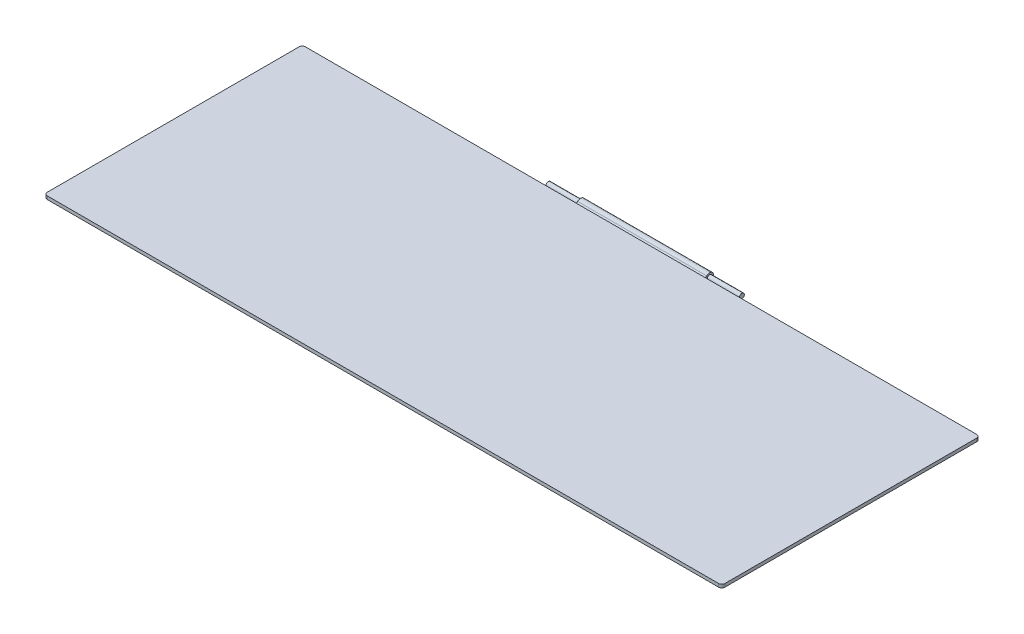
ISO-10303-21;
HEADER;
FILE_DESCRIPTION(('STEP AP214'),'2;1');
FILE_NAME('part.step','',(''),(''),'','','');
FILE_SCHEMA(('AUTOMOTIVE_DESIGN { 1 0 10303 214 1 1 1 1 }'));
ENDSEC;
DATA;
#1=APPLICATION_CONTEXT('core data for automotive mechanical design processes');
#2=APPLICATION_PROTOCOL_DEFINITION('international standard','automotive_design',2000,#1);
#3=PRODUCT_CONTEXT('',#1,'mechanical');
#4=PRODUCT('Part','Part','',(#3));
#5=PRODUCT_RELATED_PRODUCT_CATEGORY('part','',(#4));
#6=PRODUCT_DEFINITION_FORMATION('','',#4);
#7=PRODUCT_DEFINITION_CONTEXT('part definition',#1,'design');
#8=PRODUCT_DEFINITION('design','',#6,#7);
#9=PRODUCT_DEFINITION_SHAPE('','',#8);
#10=(LENGTH_UNIT() NAMED_UNIT(*) SI_UNIT(.MILLI.,.METRE.));
#11=(NAMED_UNIT(*) PLANE_ANGLE_UNIT() SI_UNIT($,.RADIAN.));
#12=(NAMED_UNIT(*) SI_UNIT($,.STERADIAN.) SOLID_ANGLE_UNIT());
#13=UNCERTAINTY_MEASURE_WITH_UNIT(LENGTH_MEASURE(1.E-05),#10,'distance_accuracy_value','');
#14=(GEOMETRIC_REPRESENTATION_CONTEXT(3) GLOBAL_UNCERTAINTY_ASSIGNED_CONTEXT((#13)) GLOBAL_UNIT_ASSIGNED_CONTEXT((#10,
#11,#12)) REPRESENTATION_CONTEXT('',''));
#15=CARTESIAN_POINT('',(0.,0.,0.));
#16=DIRECTION('',(0.,0.,1.));
#17=DIRECTION('',(1.,0.,0.));
#18=AXIS2_PLACEMENT_3D('',#15,#16,#17);
#19=CARTESIAN_POINT('',(0.,0.,0.));
#20=DIRECTION('',(0.,0.,-1.));
#21=DIRECTION('',(-1.,0.,0.));
#22=AXIS2_PLACEMENT_3D('',#19,#20,#21);
#23=PLANE('',#22);
#24=DIRECTION('',(-1.,0.,0.));
#25=VECTOR('',#24,1.);
#26=CARTESIAN_POINT('',(266.7,-1.26999999999997,0.));
#27=LINE('',#26,#25);
#28=CARTESIAN_POINT('',(264.16,-1.26999999999997,0.));
#29=VERTEX_POINT('',#28);
#30=CARTESIAN_POINT('',(50.8,-1.26999999999999,0.));
#31=VERTEX_POINT('',#30);
#32=EDGE_CURVE('E179',#29,#31,#27,.T.);
#33=ORIENTED_EDGE('',*,*,#32,.T.);
#34=DIRECTION('',(0.,1.,0.));
#35=VECTOR('',#34,1.);
#36=CARTESIAN_POINT('',(50.8,0.,0.));
#37=LINE('',#36,#35);
#38=CARTESIAN_POINT('',(50.8,1.27000000000001,0.));
#39=VERTEX_POINT('',#38);
#40=EDGE_CURVE('E50',#31,#39,#37,.T.);
#41=ORIENTED_EDGE('',*,*,#40,.T.);
#42=DIRECTION('',(-1.,0.,0.));
#43=VECTOR('',#42,1.);
#44=CARTESIAN_POINT('',(266.7,1.27000000000003,0.));
#45=LINE('',#44,#43);
#46=CARTESIAN_POINT('',(264.16,1.27000000000003,0.));
#47=VERTEX_POINT('',#46);
#48=EDGE_CURVE('E175',#47,#39,#45,.T.);
#49=ORIENTED_EDGE('',*,*,#48,.F.);
#50=DIRECTION('',(0.,-1.,0.));
#51=VECTOR('',#50,1.);
#52=CARTESIAN_POINT('',(264.16,0.,0.));
#53=LINE('',#52,#51);
#54=EDGE_CURVE('E208',#47,#29,#53,.T.);
#55=ORIENTED_EDGE('',*,*,#54,.T.);
#56=EDGE_LOOP('',(#33,#41,#49,#55));
#57=FACE_BOUND('',#56,.T.);
#58=ADVANCED_FACE('F35',(#57),#23,.T.);
#59=CARTESIAN_POINT('',(266.7,1.27000000000003,203.2));
#60=DIRECTION('',(1.,0.,0.));
#61=DIRECTION('',(0.,0.,-1.));
#62=AXIS2_PLACEMENT_3D('',#59,#60,#61);
#63=PLANE('',#62);
#64=DIRECTION('',(0.,0.,-1.));
#65=VECTOR('',#64,1.);
#66=CARTESIAN_POINT('',(266.7,-1.26999999999997,203.2));
#67=LINE('',#66,#65);
#68=CARTESIAN_POINT('',(266.7,-1.26999999999997,200.66));
#69=VERTEX_POINT('',#68);
#70=CARTESIAN_POINT('',(266.7,-1.26999999999997,2.53999999999999));
#71=VERTEX_POINT('',#70);
#72=EDGE_CURVE('E178',#69,#71,#67,.T.);
#73=ORIENTED_EDGE('',*,*,#72,.T.);
#74=DIRECTION('',(0.,-1.,0.));
#75=VECTOR('',#74,1.);
#76=CARTESIAN_POINT('',(266.7,1.27000000000003,2.53999999999999));
#77=LINE('',#76,#75);
#78=CARTESIAN_POINT('',(266.7,1.27000000000003,2.53999999999999));
#79=VERTEX_POINT('',#78);
#80=EDGE_CURVE('E225',#71,#79,#77,.F.);
#81=ORIENTED_EDGE('',*,*,#80,.T.);
#82=DIRECTION('',(0.,0.,-1.));
#83=VECTOR('',#82,1.);
#84=CARTESIAN_POINT('',(266.7,1.27000000000003,203.2));
#85=LINE('',#84,#83);
#86=CARTESIAN_POINT('',(266.7,1.27000000000003,200.66));
#87=VERTEX_POINT('',#86);
#88=EDGE_CURVE('E183',#87,#79,#85,.T.);
#89=ORIENTED_EDGE('',*,*,#88,.F.);
#90=DIRECTION('',(0.,-1.,0.));
#91=VECTOR('',#90,1.);
#92=CARTESIAN_POINT('',(266.7,-1.26999999999997,200.66));
#93=LINE('',#92,#91);
#94=EDGE_CURVE('E222',#87,#69,#93,.T.);
#95=ORIENTED_EDGE('',*,*,#94,.T.);
#96=EDGE_LOOP('',(#73,#81,#89,#95));
#97=FACE_BOUND('',#96,.T.);
#98=ADVANCED_FACE('F246',(#97),#63,.T.);
#99=CARTESIAN_POINT('',(266.7,1.27000000000003,203.2));
#100=DIRECTION('',(0.,-1.,0.));
#101=DIRECTION('',(1.,0.,0.));
#102=AXIS2_PLACEMENT_3D('',#99,#100,#101);
#103=PLANE('',#102);
#104=ORIENTED_EDGE('',*,*,#48,.T.);
#105=DIRECTION('',(-1.,0.,0.));
#106=VECTOR('',#105,1.);
#107=CARTESIAN_POINT('',(50.8,1.26999999999997,0.));
#108=LINE('',#107,#106);
#109=CARTESIAN_POINT('',(-50.8,1.26999999999997,0.));
#110=VERTEX_POINT('',#109);
#111=EDGE_CURVE('E149',#39,#110,#108,.T.);
#112=ORIENTED_EDGE('',*,*,#111,.T.);
#113=CARTESIAN_POINT('',(-264.16,1.26999999999997,0.));
#114=VERTEX_POINT('',#113);
#115=EDGE_CURVE('E181',#110,#114,#45,.T.);
#116=ORIENTED_EDGE('',*,*,#115,.T.);
#117=CARTESIAN_POINT('',(-264.16,1.26999999999997,2.53999999999999));
#118=DIRECTION('',(0.,-1.,0.));
#119=DIRECTION('',(1.,0.,0.));
#120=AXIS2_PLACEMENT_3D('',#117,#118,#119);
#121=CIRCLE('',#120,2.54);
#122=CARTESIAN_POINT('',(-266.7,1.26999999999997,2.53999999999999));
#123=VERTEX_POINT('',#122);
#124=EDGE_CURVE('E220',#114,#123,#121,.F.);
#125=ORIENTED_EDGE('',*,*,#124,.T.);
#126=DIRECTION('',(0.,0.,-1.));
#127=VECTOR('',#126,1.);
#128=CARTESIAN_POINT('',(-266.7,1.26999999999997,203.2));
#129=LINE('',#128,#127);
#130=CARTESIAN_POINT('',(-266.7,1.26999999999997,200.66));
#131=VERTEX_POINT('',#130);
#132=EDGE_CURVE('E187',#131,#123,#129,.T.);
#133=ORIENTED_EDGE('',*,*,#132,.F.);
#134=CARTESIAN_POINT('',(-264.16,1.26999999999997,200.66));
#135=DIRECTION('',(0.,-1.,0.));
#136=DIRECTION('',(1.,0.,0.));
#137=AXIS2_PLACEMENT_3D('',#134,#135,#136);
#138=CIRCLE('',#137,2.54);
#139=CARTESIAN_POINT('',(-264.16,1.26999999999997,203.2));
#140=VERTEX_POINT('',#139);
#141=EDGE_CURVE('E214',#131,#140,#138,.F.);
#142=ORIENTED_EDGE('',*,*,#141,.T.);
#143=DIRECTION('',(-1.,0.,0.));
#144=VECTOR('',#143,1.);
#145=CARTESIAN_POINT('',(266.7,1.27000000000003,203.2));
#146=LINE('',#145,#144);
#147=CARTESIAN_POINT('',(264.16,1.27000000000003,203.2));
#148=VERTEX_POINT('',#147);
#149=EDGE_CURVE('E174',#148,#140,#146,.T.);
#150=ORIENTED_EDGE('',*,*,#149,.F.);
#151=CARTESIAN_POINT('',(264.16,1.27000000000003,200.66));
#152=DIRECTION('',(0.,-1.,0.));
#153=DIRECTION('',(1.,0.,0.));
#154=AXIS2_PLACEMENT_3D('',#151,#152,#153);
#155=CIRCLE('',#154,2.54);
#156=EDGE_CURVE('E216',#148,#87,#155,.F.);
#157=ORIENTED_EDGE('',*,*,#156,.T.);
#158=ORIENTED_EDGE('',*,*,#88,.T.);
#159=CARTESIAN_POINT('',(264.16,1.27000000000003,2.54));
#160=DIRECTION('',(0.,-1.,0.));
#161=DIRECTION('',(1.,0.,0.));
#162=AXIS2_PLACEMENT_3D('',#159,#160,#161);
#163=CIRCLE('',#162,2.54);
#164=EDGE_CURVE('E218',#79,#47,#163,.F.);
#165=ORIENTED_EDGE('',*,*,#164,.T.);
#166=EDGE_LOOP('',(#104,#112,#116,#125,#133,#142,#150,#157,#158,#165));
#167=FACE_BOUND('',#166,.T.);
#168=ADVANCED_FACE('F238',(#167),#103,.F.);
#169=CARTESIAN_POINT('',(-266.7,1.26999999999997,203.2));
#170=DIRECTION('',(1.,0.,0.));
#171=DIRECTION('',(0.,0.,-1.));
#172=AXIS2_PLACEMENT_3D('',#169,#170,#171);
#173=PLANE('',#172);
#174=ORIENTED_EDGE('',*,*,#132,.T.);
#175=DIRECTION('',(0.,-1.,0.));
#176=VECTOR('',#175,1.);
#177=CARTESIAN_POINT('',(-266.7,-1.27000000000003,2.53999999999999));
#178=LINE('',#177,#176);
#179=CARTESIAN_POINT('',(-266.7,-1.27000000000003,2.53999999999999));
#180=VERTEX_POINT('',#179);
#181=EDGE_CURVE('E196',#123,#180,#178,.T.);
#182=ORIENTED_EDGE('',*,*,#181,.T.);
#183=DIRECTION('',(0.,0.,-1.));
#184=VECTOR('',#183,1.);
#185=CARTESIAN_POINT('',(-266.7,-1.27000000000003,203.2));
#186=LINE('',#185,#184);
#187=CARTESIAN_POINT('',(-266.7,-1.27000000000003,200.66));
#188=VERTEX_POINT('',#187);
#189=EDGE_CURVE('E190',#188,#180,#186,.T.);
#190=ORIENTED_EDGE('',*,*,#189,.F.);
#191=DIRECTION('',(0.,-1.,0.));
#192=VECTOR('',#191,1.);
#193=CARTESIAN_POINT('',(-266.7,1.26999999999997,200.66));
#194=LINE('',#193,#192);
#195=EDGE_CURVE('E186',#188,#131,#194,.F.);
#196=ORIENTED_EDGE('',*,*,#195,.T.);
#197=EDGE_LOOP('',(#174,#182,#190,#196));
#198=FACE_BOUND('',#197,.T.);
#199=ADVANCED_FACE('F268',(#198),#173,.F.);
#200=CARTESIAN_POINT('',(266.7,-1.26999999999997,203.2));
#201=DIRECTION('',(0.,-1.,0.));
#202=DIRECTION('',(1.,0.,0.));
#203=AXIS2_PLACEMENT_3D('',#200,#201,#202);
#204=PLANE('',#203);
#205=ORIENTED_EDGE('',*,*,#189,.T.);
#206=CARTESIAN_POINT('',(-264.16,-1.27000000000003,2.53999999999999));
#207=DIRECTION('',(0.,-1.,0.));
#208=DIRECTION('',(1.,0.,0.));
#209=AXIS2_PLACEMENT_3D('',#206,#207,#208);
#210=CIRCLE('',#209,2.54);
#211=CARTESIAN_POINT('',(-264.16,-1.27000000000003,0.));
#212=VERTEX_POINT('',#211);
#213=EDGE_CURVE('E205',#180,#212,#210,.T.);
#214=ORIENTED_EDGE('',*,*,#213,.T.);
#215=CARTESIAN_POINT('',(-50.8,-1.27000000000001,0.));
#216=VERTEX_POINT('',#215);
#217=EDGE_CURVE('E166',#216,#212,#27,.T.);
#218=ORIENTED_EDGE('',*,*,#217,.F.);
#219=DIRECTION('',(-1.,0.,0.));
#220=VECTOR('',#219,1.);
#221=CARTESIAN_POINT('',(50.8,-1.27000000000003,0.));
#222=LINE('',#221,#220);
#223=EDGE_CURVE('E167',#31,#216,#222,.T.);
#224=ORIENTED_EDGE('',*,*,#223,.F.);
#225=ORIENTED_EDGE('',*,*,#32,.F.);
#226=CARTESIAN_POINT('',(264.16,-1.26999999999997,2.54));
#227=DIRECTION('',(0.,-1.,0.));
#228=DIRECTION('',(1.,0.,0.));
#229=AXIS2_PLACEMENT_3D('',#226,#227,#228);
#230=CIRCLE('',#229,2.54);
#231=EDGE_CURVE('E203',#29,#71,#230,.T.);
#232=ORIENTED_EDGE('',*,*,#231,.T.);
#233=ORIENTED_EDGE('',*,*,#72,.F.);
#234=CARTESIAN_POINT('',(264.16,-1.26999999999997,200.66));
#235=DIRECTION('',(0.,-1.,0.));
#236=DIRECTION('',(1.,0.,0.));
#237=AXIS2_PLACEMENT_3D('',#234,#235,#236);
#238=CIRCLE('',#237,2.54);
#239=CARTESIAN_POINT('',(264.16,-1.26999999999997,203.2));
#240=VERTEX_POINT('',#239);
#241=EDGE_CURVE('E201',#69,#240,#238,.T.);
#242=ORIENTED_EDGE('',*,*,#241,.T.);
#243=DIRECTION('',(-1.,0.,0.));
#244=VECTOR('',#243,1.);
#245=CARTESIAN_POINT('',(266.7,-1.26999999999997,203.2));
#246=LINE('',#245,#244);
#247=CARTESIAN_POINT('',(-264.16,-1.27000000000003,203.2));
#248=VERTEX_POINT('',#247);
#249=EDGE_CURVE('E171',#240,#248,#246,.T.);
#250=ORIENTED_EDGE('',*,*,#249,.T.);
#251=CARTESIAN_POINT('',(-264.16,-1.27000000000003,200.66));
#252=DIRECTION('',(0.,-1.,0.));
#253=DIRECTION('',(1.,0.,0.));
#254=AXIS2_PLACEMENT_3D('',#251,#252,#253);
#255=CIRCLE('',#254,2.54);
#256=EDGE_CURVE('E199',#248,#188,#255,.T.);
#257=ORIENTED_EDGE('',*,*,#256,.T.);
#258=EDGE_LOOP('',(#205,#214,#218,#224,#225,#232,#233,#242,#250,#257));
#259=FACE_BOUND('',#258,.T.);
#260=ADVANCED_FACE('F249',(#259),#204,.T.);
#261=CARTESIAN_POINT('',(0.,0.,203.2));
#262=DIRECTION('',(0.,0.,-1.));
#263=DIRECTION('',(-1.,0.,0.));
#264=AXIS2_PLACEMENT_3D('',#261,#262,#263);
#265=PLANE('',#264);
#266=ORIENTED_EDGE('',*,*,#249,.F.);
#267=DIRECTION('',(0.,-1.,0.));
#268=VECTOR('',#267,1.);
#269=CARTESIAN_POINT('',(264.16,1.27000000000003,203.2));
#270=LINE('',#269,#268);
#271=EDGE_CURVE('E43',#240,#148,#270,.F.);
#272=ORIENTED_EDGE('',*,*,#271,.T.);
#273=ORIENTED_EDGE('',*,*,#149,.T.);
#274=DIRECTION('',(0.,-1.,0.));
#275=VECTOR('',#274,1.);
#276=CARTESIAN_POINT('',(-264.16,0.,203.2));
#277=LINE('',#276,#275);
#278=EDGE_CURVE('E227',#140,#248,#277,.T.);
#279=ORIENTED_EDGE('',*,*,#278,.T.);
#280=EDGE_LOOP('',(#266,#272,#273,#279));
#281=FACE_BOUND('',#280,.T.);
#282=ADVANCED_FACE('F233',(#281),#265,.F.);
#283=DIRECTION('',(0.,1.,0.));
#284=VECTOR('',#283,1.);
#285=CARTESIAN_POINT('',(-50.8,0.,0.));
#286=LINE('',#285,#284);
#287=EDGE_CURVE('E58',#216,#110,#286,.T.);
#288=ORIENTED_EDGE('',*,*,#287,.F.);
#289=ORIENTED_EDGE('',*,*,#217,.T.);
#290=DIRECTION('',(0.,-1.,0.));
#291=VECTOR('',#290,1.);
#292=CARTESIAN_POINT('',(-264.16,1.26999999999997,0.));
#293=LINE('',#292,#291);
#294=EDGE_CURVE('E211',#212,#114,#293,.F.);
#295=ORIENTED_EDGE('',*,*,#294,.T.);
#296=ORIENTED_EDGE('',*,*,#115,.F.);
#297=EDGE_LOOP('',(#288,#289,#295,#296));
#298=FACE_BOUND('',#297,.T.);
#299=ADVANCED_FACE('F255',(#298),#23,.T.);
#300=CARTESIAN_POINT('',(-264.16,1.26999999999997,2.53999999999999));
#301=DIRECTION('',(0.,1.,0.));
#302=DIRECTION('',(0.,0.,1.));
#303=AXIS2_PLACEMENT_3D('',#300,#301,#302);
#304=CYLINDRICAL_SURFACE('',#303,2.54);
#305=ORIENTED_EDGE('',*,*,#124,.F.);
#306=ORIENTED_EDGE('',*,*,#294,.F.);
#307=ORIENTED_EDGE('',*,*,#213,.F.);
#308=ORIENTED_EDGE('',*,*,#181,.F.);
#309=EDGE_LOOP('',(#305,#306,#307,#308));
#310=FACE_BOUND('',#309,.T.);
#311=ADVANCED_FACE('F266',(#310),#304,.T.);
#312=CARTESIAN_POINT('',(264.16,0.,2.54));
#313=DIRECTION('',(0.,-1.,0.));
#314=DIRECTION('',(0.,0.,-1.));
#315=AXIS2_PLACEMENT_3D('',#312,#313,#314);
#316=CYLINDRICAL_SURFACE('',#315,2.54);
#317=ORIENTED_EDGE('',*,*,#164,.F.);
#318=ORIENTED_EDGE('',*,*,#80,.F.);
#319=ORIENTED_EDGE('',*,*,#231,.F.);
#320=ORIENTED_EDGE('',*,*,#54,.F.);
#321=EDGE_LOOP('',(#317,#318,#319,#320));
#322=FACE_BOUND('',#321,.T.);
#323=ADVANCED_FACE('F254',(#322),#316,.T.);
#324=CARTESIAN_POINT('',(264.16,1.27000000000003,200.66));
#325=DIRECTION('',(0.,1.,0.));
#326=DIRECTION('',(0.,0.,1.));
#327=AXIS2_PLACEMENT_3D('',#324,#325,#326);
#328=CYLINDRICAL_SURFACE('',#327,2.54);
#329=ORIENTED_EDGE('',*,*,#156,.F.);
#330=ORIENTED_EDGE('',*,*,#271,.F.);
#331=ORIENTED_EDGE('',*,*,#241,.F.);
#332=ORIENTED_EDGE('',*,*,#94,.F.);
#333=EDGE_LOOP('',(#329,#330,#331,#332));
#334=FACE_BOUND('',#333,.T.);
#335=ADVANCED_FACE('F243',(#334),#328,.T.);
#336=CARTESIAN_POINT('',(-264.16,0.,200.66));
#337=DIRECTION('',(0.,-1.,0.));
#338=DIRECTION('',(0.,0.,-1.));
#339=AXIS2_PLACEMENT_3D('',#336,#337,#338);
#340=CYLINDRICAL_SURFACE('',#339,2.54);
#341=ORIENTED_EDGE('',*,*,#141,.F.);
#342=ORIENTED_EDGE('',*,*,#195,.F.);
#343=ORIENTED_EDGE('',*,*,#256,.F.);
#344=ORIENTED_EDGE('',*,*,#278,.F.);
#345=EDGE_LOOP('',(#341,#342,#343,#344));
#346=FACE_BOUND('',#345,.T.);
#347=ADVANCED_FACE('F37',(#346),#340,.T.);
#348=CARTESIAN_POINT('',(50.8,0.604042806183076,0.634244946492254));
#349=DIRECTION('',(0.,0.68965517241378,0.724137931034496));
#350=DIRECTION('',(0.,-0.724137931034496,0.68965517241378));
#351=AXIS2_PLACEMENT_3D('',#348,#349,#350);
#352=PLANE('',#351);
#353=DIRECTION('',(0.,0.724137931034496,-0.68965517241378));
#354=VECTOR('',#353,1.);
#355=CARTESIAN_POINT('',(-50.8,0.604042806183076,0.634244946492254));
#356=LINE('',#355,#354);
#357=CARTESIAN_POINT('',(-50.8,2.18965517241383,-0.875862068965555));
#358=VERTEX_POINT('',#357);
#359=EDGE_CURVE('E159',#110,#358,#356,.T.);
#360=ORIENTED_EDGE('',*,*,#359,.F.);
#361=ORIENTED_EDGE('',*,*,#111,.F.);
#362=DIRECTION('',(0.,0.724137931034496,-0.68965517241378));
#363=VECTOR('',#362,1.);
#364=CARTESIAN_POINT('',(50.8,0.604042806183076,0.634244946492254));
#365=LINE('',#364,#363);
#366=CARTESIAN_POINT('',(50.8,2.18965517241383,-0.875862068965555));
#367=VERTEX_POINT('',#366);
#368=EDGE_CURVE('E142',#39,#367,#365,.T.);
#369=ORIENTED_EDGE('',*,*,#368,.T.);
#370=DIRECTION('',(-1.,0.,0.));
#371=VECTOR('',#370,1.);
#372=CARTESIAN_POINT('',(50.8,2.18965517241383,-0.875862068965555));
#373=LINE('',#372,#371);
#374=EDGE_CURVE('E127',#367,#358,#373,.T.);
#375=ORIENTED_EDGE('',*,*,#374,.T.);
#376=EDGE_LOOP('',(#360,#361,#369,#375));
#377=FACE_BOUND('',#376,.T.);
#378=ADVANCED_FACE('F148',(#377),#352,.T.);
#379=CARTESIAN_POINT('',(50.8,-0.604042806183151,0.634244946492288));
#380=DIRECTION('',(0.,0.689655172413805,-0.724137931034471));
#381=DIRECTION('',(0.,0.724137931034472,0.689655172413805));
#382=AXIS2_PLACEMENT_3D('',#379,#380,#381);
#383=PLANE('',#382);
#384=DIRECTION('',(0.,-0.724137931034472,-0.689655172413805));
#385=VECTOR('',#384,1.);
#386=CARTESIAN_POINT('',(-50.8,-0.604042806183151,0.634244946492288));
#387=LINE('',#386,#385);
#388=CARTESIAN_POINT('',(-50.8,-2.18965517241383,-0.875862068965555));
#389=VERTEX_POINT('',#388);
#390=EDGE_CURVE('E151',#216,#389,#387,.T.);
#391=ORIENTED_EDGE('',*,*,#390,.T.);
#392=DIRECTION('',(-1.,0.,0.));
#393=VECTOR('',#392,1.);
#394=CARTESIAN_POINT('',(50.8,-2.18965517241383,-0.875862068965555));
#395=LINE('',#394,#393);
#396=CARTESIAN_POINT('',(50.8,-2.18965517241383,-0.875862068965555));
#397=VERTEX_POINT('',#396);
#398=EDGE_CURVE('E137',#397,#389,#395,.T.);
#399=ORIENTED_EDGE('',*,*,#398,.F.);
#400=DIRECTION('',(0.,-0.724137931034472,-0.689655172413805));
#401=VECTOR('',#400,1.);
#402=CARTESIAN_POINT('',(50.8,-0.604042806183151,0.634244946492288));
#403=LINE('',#402,#401);
#404=EDGE_CURVE('E144',#31,#397,#403,.T.);
#405=ORIENTED_EDGE('',*,*,#404,.F.);
#406=ORIENTED_EDGE('',*,*,#223,.T.);
#407=EDGE_LOOP('',(#391,#399,#405,#406));
#408=FACE_BOUND('',#407,.T.);
#409=ADVANCED_FACE('F262',(#408),#383,.F.);
#410=CARTESIAN_POINT('',(50.8,0.,-3.175));
#411=DIRECTION('',(-1.,0.,0.));
#412=DIRECTION('',(0.,0.,1.));
#413=AXIS2_PLACEMENT_3D('',#410,#411,#412);
#414=CYLINDRICAL_SURFACE('',#413,3.175);
#415=CARTESIAN_POINT('',(-50.8,0.,-3.175));
#416=DIRECTION('',(-1.,0.,0.));
#417=DIRECTION('',(0.,0.,1.));
#418=AXIS2_PLACEMENT_3D('',#415,#416,#417);
#419=CIRCLE('',#418,3.175);
#420=EDGE_CURVE('E132',#358,#389,#419,.T.);
#421=ORIENTED_EDGE('',*,*,#420,.F.);
#422=ORIENTED_EDGE('',*,*,#374,.F.);
#423=CARTESIAN_POINT('',(50.8,0.,-3.175));
#424=DIRECTION('',(-1.,0.,0.));
#425=DIRECTION('',(0.,0.,1.));
#426=AXIS2_PLACEMENT_3D('',#423,#424,#425);
#427=CIRCLE('',#426,3.175);
#428=EDGE_CURVE('E130',#367,#397,#427,.T.);
#429=ORIENTED_EDGE('',*,*,#428,.T.);
#430=ORIENTED_EDGE('',*,*,#398,.T.);
#431=EDGE_LOOP('',(#421,#422,#429,#430));
#432=FACE_BOUND('',#431,.T.);
#433=ADVANCED_FACE('F129',(#432),#414,.T.);
#434=CARTESIAN_POINT('',(50.8,0.,0.));
#435=DIRECTION('',(-1.,0.,0.));
#436=DIRECTION('',(0.,0.,1.));
#437=AXIS2_PLACEMENT_3D('',#434,#435,#436);
#438=PLANE('',#437);
#439=CARTESIAN_POINT('',(50.8,0.,-3.175));
#440=DIRECTION('',(-1.,0.,0.));
#441=DIRECTION('',(0.,0.,1.));
#442=AXIS2_PLACEMENT_3D('',#439,#440,#441);
#443=CIRCLE('',#442,1.905);
#444=CARTESIAN_POINT('',(50.8,0.,-1.27));
#445=VERTEX_POINT('',#444);
#446=EDGE_CURVE('E11',#445,#445,#443,.F.);
#447=ORIENTED_EDGE('',*,*,#446,.F.);
#448=EDGE_LOOP('',(#447));
#449=FACE_BOUND('',#448,.T.);
#450=ORIENTED_EDGE('',*,*,#368,.F.);
#451=ORIENTED_EDGE('',*,*,#40,.F.);
#452=ORIENTED_EDGE('',*,*,#404,.T.);
#453=ORIENTED_EDGE('',*,*,#428,.F.);
#454=EDGE_LOOP('',(#450,#451,#452,#453));
#455=FACE_BOUND('',#454,.T.);
#456=ADVANCED_FACE('F141',(#449,#455),#438,.F.);
#457=CARTESIAN_POINT('',(-50.8,0.,0.));
#458=DIRECTION('',(-1.,0.,0.));
#459=DIRECTION('',(0.,0.,1.));
#460=AXIS2_PLACEMENT_3D('',#457,#458,#459);
#461=PLANE('',#460);
#462=CARTESIAN_POINT('',(-50.8,0.,-3.175));
#463=DIRECTION('',(-1.,0.,0.));
#464=DIRECTION('',(0.,0.,1.));
#465=AXIS2_PLACEMENT_3D('',#462,#463,#464);
#466=CIRCLE('',#465,1.905);
#467=CARTESIAN_POINT('',(-50.8,0.,-1.27));
#468=VERTEX_POINT('',#467);
#469=EDGE_CURVE('E154',#468,#468,#466,.T.);
#470=ORIENTED_EDGE('',*,*,#469,.F.);
#471=EDGE_LOOP('',(#470));
#472=FACE_BOUND('',#471,.T.);
#473=ORIENTED_EDGE('',*,*,#359,.T.);
#474=ORIENTED_EDGE('',*,*,#420,.T.);
#475=ORIENTED_EDGE('',*,*,#390,.F.);
#476=ORIENTED_EDGE('',*,*,#287,.T.);
#477=EDGE_LOOP('',(#473,#474,#475,#476));
#478=FACE_BOUND('',#477,.T.);
#479=ADVANCED_FACE('F260',(#472,#478),#461,.T.);
#480=CARTESIAN_POINT('',(-76.2,0.,-3.175));
#481=DIRECTION('',(1.,0.,0.));
#482=DIRECTION('',(0.,0.,-1.));
#483=AXIS2_PLACEMENT_3D('',#480,#481,#482);
#484=CYLINDRICAL_SURFACE('',#483,1.905);
#485=CARTESIAN_POINT('',(-76.2,0.,-3.175));
#486=DIRECTION('',(-1.,0.,0.));
#487=DIRECTION('',(0.,0.,1.));
#488=AXIS2_PLACEMENT_3D('',#485,#486,#487);
#489=CIRCLE('',#488,1.905);
#490=CARTESIAN_POINT('',(-76.2,0.,-1.27));
#491=VERTEX_POINT('',#490);
#492=EDGE_CURVE('E161',#491,#491,#489,.T.);
#493=ORIENTED_EDGE('',*,*,#492,.F.);
#494=EDGE_LOOP('',(#493));
#495=FACE_BOUND('',#494,.T.);
#496=ORIENTED_EDGE('',*,*,#469,.T.);
#497=EDGE_LOOP('',(#496));
#498=FACE_BOUND('',#497,.T.);
#499=ADVANCED_FACE('F305',(#495,#498),#484,.T.);
#500=CARTESIAN_POINT('',(-76.2,0.,-3.175));
#501=DIRECTION('',(-1.,0.,0.));
#502=DIRECTION('',(0.,0.,1.));
#503=AXIS2_PLACEMENT_3D('',#500,#501,#502);
#504=PLANE('',#503);
#505=ORIENTED_EDGE('',*,*,#492,.T.);
#506=EDGE_LOOP('',(#505));
#507=FACE_BOUND('',#506,.T.);
#508=ADVANCED_FACE('F312',(#507),#504,.T.);
#509=CARTESIAN_POINT('',(76.2,0.,-3.175));
#510=DIRECTION('',(-1.,0.,0.));
#511=DIRECTION('',(0.,0.,1.));
#512=AXIS2_PLACEMENT_3D('',#509,#510,#511);
#513=CYLINDRICAL_SURFACE('',#512,1.905);
#514=CARTESIAN_POINT('',(76.2,0.,-3.175));
#515=DIRECTION('',(1.,0.,0.));
#516=DIRECTION('',(0.,0.,-1.));
#517=AXIS2_PLACEMENT_3D('',#514,#515,#516);
#518=CIRCLE('',#517,1.905);
#519=CARTESIAN_POINT('',(76.2,0.,-5.08));
#520=VERTEX_POINT('',#519);
#521=EDGE_CURVE('E328',#520,#520,#518,.T.);
#522=ORIENTED_EDGE('',*,*,#521,.F.);
#523=EDGE_LOOP('',(#522));
#524=FACE_BOUND('',#523,.T.);
#525=ORIENTED_EDGE('',*,*,#446,.T.);
#526=EDGE_LOOP('',(#525));
#527=FACE_BOUND('',#526,.T.);
#528=ADVANCED_FACE('F316',(#524,#527),#513,.T.);
#529=CARTESIAN_POINT('',(76.2,0.,-3.175));
#530=DIRECTION('',(1.,0.,0.));
#531=DIRECTION('',(0.,0.,-1.));
#532=AXIS2_PLACEMENT_3D('',#529,#530,#531);
#533=PLANE('',#532);
#534=ORIENTED_EDGE('',*,*,#521,.T.);
#535=EDGE_LOOP('',(#534));
#536=FACE_BOUND('',#535,.T.);
#537=ADVANCED_FACE('F320',(#536),#533,.T.);
#538=CLOSED_SHELL('',(#58,#98,#168,#199,#260,#282,#299,#311,#323,#335,#347,#378,#409,#433,#456,
#479,#499,#508,#528,#537));
#539=MANIFOLD_SOLID_BREP('B2',#538);
#540=ADVANCED_BREP_SHAPE_REPRESENTATION('',(#18,#539),#14);
#541=SHAPE_DEFINITION_REPRESENTATION(#9,#540);
ENDSEC;
END-ISO-10303-21;
